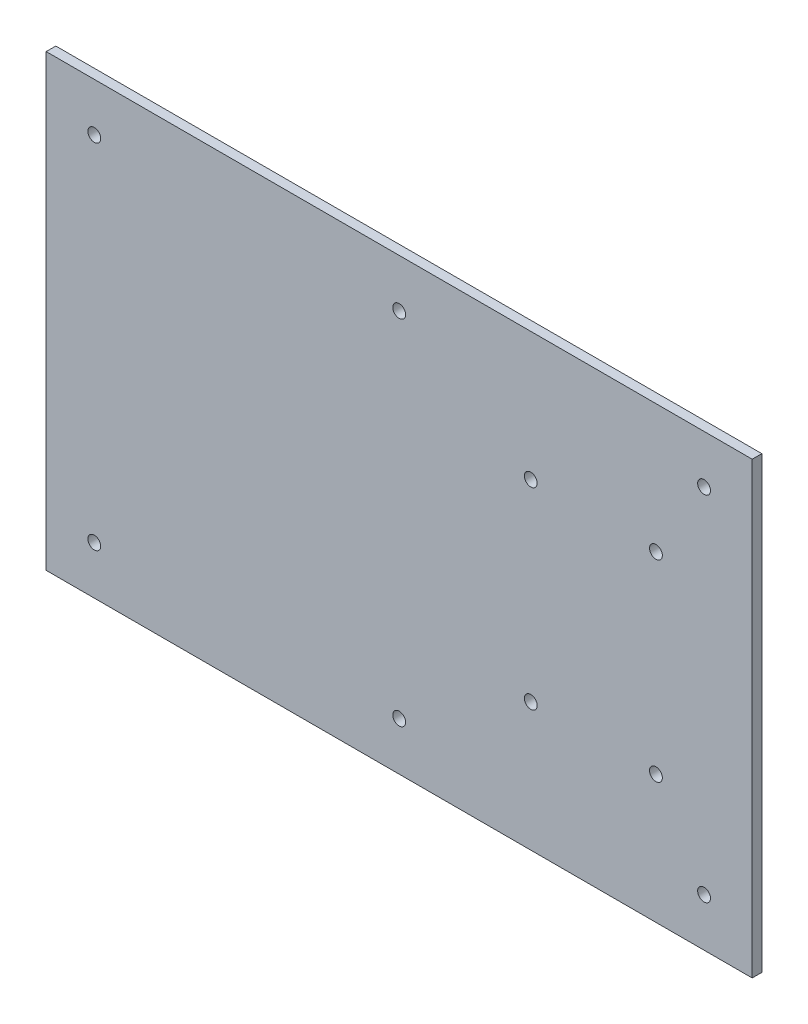
ISO-10303-21;
HEADER;
FILE_DESCRIPTION(('STEP AP214'),'2;1');
FILE_NAME('part.step','',(''),(''),'','','');
FILE_SCHEMA(('AUTOMOTIVE_DESIGN { 1 0 10303 214 1 1 1 1 }'));
ENDSEC;
DATA;
#1=APPLICATION_CONTEXT('core data for automotive mechanical design processes');
#2=APPLICATION_PROTOCOL_DEFINITION('international standard','automotive_design',2000,#1);
#3=PRODUCT_CONTEXT('',#1,'mechanical');
#4=PRODUCT('Part','Part','',(#3));
#5=PRODUCT_RELATED_PRODUCT_CATEGORY('part','',(#4));
#6=PRODUCT_DEFINITION_FORMATION('','',#4);
#7=PRODUCT_DEFINITION_CONTEXT('part definition',#1,'design');
#8=PRODUCT_DEFINITION('design','',#6,#7);
#9=PRODUCT_DEFINITION_SHAPE('','',#8);
#10=(LENGTH_UNIT() NAMED_UNIT(*) SI_UNIT(.MILLI.,.METRE.));
#11=(NAMED_UNIT(*) PLANE_ANGLE_UNIT() SI_UNIT($,.RADIAN.));
#12=(NAMED_UNIT(*) SI_UNIT($,.STERADIAN.) SOLID_ANGLE_UNIT());
#13=UNCERTAINTY_MEASURE_WITH_UNIT(LENGTH_MEASURE(1.E-05),#10,'distance_accuracy_value','');
#14=(GEOMETRIC_REPRESENTATION_CONTEXT(3) GLOBAL_UNCERTAINTY_ASSIGNED_CONTEXT((#13)) GLOBAL_UNIT_ASSIGNED_CONTEXT((#10,
#11,#12)) REPRESENTATION_CONTEXT('',''));
#15=CARTESIAN_POINT('',(0.,0.,0.));
#16=DIRECTION('',(0.,0.,1.));
#17=DIRECTION('',(1.,0.,0.));
#18=AXIS2_PLACEMENT_3D('',#15,#16,#17);
#19=CARTESIAN_POINT('',(0.,0.,3.));
#20=DIRECTION('',(1.,0.,0.));
#21=DIRECTION('',(0.,0.,-1.));
#22=AXIS2_PLACEMENT_3D('',#19,#20,#21);
#23=PLANE('',#22);
#24=DIRECTION('',(0.,-1.,0.));
#25=VECTOR('',#24,1.);
#26=CARTESIAN_POINT('',(0.,0.,0.));
#27=LINE('',#26,#25);
#28=CARTESIAN_POINT('',(0.,140.,0.));
#29=VERTEX_POINT('',#28);
#30=CARTESIAN_POINT('',(0.,0.,0.));
#31=VERTEX_POINT('',#30);
#32=EDGE_CURVE('E103',#29,#31,#27,.T.);
#33=ORIENTED_EDGE('',*,*,#32,.T.);
#34=DIRECTION('',(0.,0.,-1.));
#35=VECTOR('',#34,1.);
#36=CARTESIAN_POINT('',(0.,0.,3.));
#37=LINE('',#36,#35);
#38=CARTESIAN_POINT('',(0.,0.,3.));
#39=VERTEX_POINT('',#38);
#40=EDGE_CURVE('E11',#39,#31,#37,.T.);
#41=ORIENTED_EDGE('',*,*,#40,.F.);
#42=DIRECTION('',(0.,-1.,0.));
#43=VECTOR('',#42,1.);
#44=CARTESIAN_POINT('',(0.,0.,3.));
#45=LINE('',#44,#43);
#46=CARTESIAN_POINT('',(0.,140.,3.));
#47=VERTEX_POINT('',#46);
#48=EDGE_CURVE('E90',#47,#39,#45,.T.);
#49=ORIENTED_EDGE('',*,*,#48,.F.);
#50=DIRECTION('',(0.,0.,-1.));
#51=VECTOR('',#50,1.);
#52=CARTESIAN_POINT('',(0.,140.,3.));
#53=LINE('',#52,#51);
#54=EDGE_CURVE('E99',#47,#29,#53,.T.);
#55=ORIENTED_EDGE('',*,*,#54,.T.);
#56=EDGE_LOOP('',(#33,#41,#49,#55));
#57=FACE_BOUND('',#56,.T.);
#58=ADVANCED_FACE('F37',(#57),#23,.F.);
#59=CARTESIAN_POINT('',(0.,0.,3.));
#60=DIRECTION('',(0.,1.,0.));
#61=DIRECTION('',(0.,0.,1.));
#62=AXIS2_PLACEMENT_3D('',#59,#60,#61);
#63=PLANE('',#62);
#64=DIRECTION('',(1.,0.,0.));
#65=VECTOR('',#64,1.);
#66=CARTESIAN_POINT('',(0.,0.,0.));
#67=LINE('',#66,#65);
#68=CARTESIAN_POINT('',(220.,0.,0.));
#69=VERTEX_POINT('',#68);
#70=EDGE_CURVE('E94',#31,#69,#67,.T.);
#71=ORIENTED_EDGE('',*,*,#70,.T.);
#72=DIRECTION('',(0.,0.,-1.));
#73=VECTOR('',#72,1.);
#74=CARTESIAN_POINT('',(220.,0.,3.));
#75=LINE('',#74,#73);
#76=CARTESIAN_POINT('',(220.,0.,3.));
#77=VERTEX_POINT('',#76);
#78=EDGE_CURVE('E46',#77,#69,#75,.T.);
#79=ORIENTED_EDGE('',*,*,#78,.F.);
#80=DIRECTION('',(1.,0.,0.));
#81=VECTOR('',#80,1.);
#82=CARTESIAN_POINT('',(0.,0.,3.));
#83=LINE('',#82,#81);
#84=EDGE_CURVE('E85',#39,#77,#83,.T.);
#85=ORIENTED_EDGE('',*,*,#84,.F.);
#86=ORIENTED_EDGE('',*,*,#40,.T.);
#87=EDGE_LOOP('',(#71,#79,#85,#86));
#88=FACE_BOUND('',#87,.T.);
#89=ADVANCED_FACE('F93',(#88),#63,.F.);
#90=CARTESIAN_POINT('',(220.,0.,3.));
#91=DIRECTION('',(-1.,0.,0.));
#92=DIRECTION('',(0.,0.,1.));
#93=AXIS2_PLACEMENT_3D('',#90,#91,#92);
#94=PLANE('',#93);
#95=DIRECTION('',(0.,1.,0.));
#96=VECTOR('',#95,1.);
#97=CARTESIAN_POINT('',(220.,0.,0.));
#98=LINE('',#97,#96);
#99=CARTESIAN_POINT('',(220.,140.,0.));
#100=VERTEX_POINT('',#99);
#101=EDGE_CURVE('E72',#69,#100,#98,.T.);
#102=ORIENTED_EDGE('',*,*,#101,.T.);
#103=DIRECTION('',(0.,0.,-1.));
#104=VECTOR('',#103,1.);
#105=CARTESIAN_POINT('',(220.,140.,3.));
#106=LINE('',#105,#104);
#107=CARTESIAN_POINT('',(220.,140.,3.));
#108=VERTEX_POINT('',#107);
#109=EDGE_CURVE('E95',#108,#100,#106,.T.);
#110=ORIENTED_EDGE('',*,*,#109,.F.);
#111=DIRECTION('',(0.,1.,0.));
#112=VECTOR('',#111,1.);
#113=CARTESIAN_POINT('',(220.,0.,3.));
#114=LINE('',#113,#112);
#115=EDGE_CURVE('E88',#77,#108,#114,.T.);
#116=ORIENTED_EDGE('',*,*,#115,.F.);
#117=ORIENTED_EDGE('',*,*,#78,.T.);
#118=EDGE_LOOP('',(#102,#110,#116,#117));
#119=FACE_BOUND('',#118,.T.);
#120=ADVANCED_FACE('F97',(#119),#94,.F.);
#121=CARTESIAN_POINT('',(0.,140.,3.));
#122=DIRECTION('',(0.,-1.,0.));
#123=DIRECTION('',(0.,0.,-1.));
#124=AXIS2_PLACEMENT_3D('',#121,#122,#123);
#125=PLANE('',#124);
#126=DIRECTION('',(-1.,0.,0.));
#127=VECTOR('',#126,1.);
#128=CARTESIAN_POINT('',(0.,140.,0.));
#129=LINE('',#128,#127);
#130=EDGE_CURVE('E78',#100,#29,#129,.T.);
#131=ORIENTED_EDGE('',*,*,#130,.T.);
#132=ORIENTED_EDGE('',*,*,#54,.F.);
#133=DIRECTION('',(-1.,0.,0.));
#134=VECTOR('',#133,1.);
#135=CARTESIAN_POINT('',(0.,140.,3.));
#136=LINE('',#135,#134);
#137=EDGE_CURVE('E55',#108,#47,#136,.T.);
#138=ORIENTED_EDGE('',*,*,#137,.F.);
#139=ORIENTED_EDGE('',*,*,#109,.T.);
#140=EDGE_LOOP('',(#131,#132,#138,#139));
#141=FACE_BOUND('',#140,.T.);
#142=ADVANCED_FACE('F175',(#141),#125,.F.);
#143=CARTESIAN_POINT('',(0.,0.,3.));
#144=DIRECTION('',(0.,0.,-1.));
#145=DIRECTION('',(-1.,0.,0.));
#146=AXIS2_PLACEMENT_3D('',#143,#144,#145);
#147=PLANE('',#146);
#148=CARTESIAN_POINT('',(151.,40.,3.));
#149=DIRECTION('',(0.,0.,1.));
#150=DIRECTION('',(1.,0.,0.));
#151=AXIS2_PLACEMENT_3D('',#148,#149,#150);
#152=CIRCLE('',#151,2.);
#153=CARTESIAN_POINT('',(153.,40.,3.));
#154=VERTEX_POINT('',#153);
#155=EDGE_CURVE('E286',#154,#154,#152,.T.);
#156=ORIENTED_EDGE('',*,*,#155,.F.);
#157=EDGE_LOOP('',(#156));
#158=FACE_BOUND('',#157,.T.);
#159=CARTESIAN_POINT('',(190.,100.,3.));
#160=DIRECTION('',(0.,0.,1.));
#161=DIRECTION('',(-1.,0.,0.));
#162=AXIS2_PLACEMENT_3D('',#159,#160,#161);
#163=CIRCLE('',#162,2.);
#164=CARTESIAN_POINT('',(188.,100.,3.));
#165=VERTEX_POINT('',#164);
#166=EDGE_CURVE('E287',#165,#165,#163,.T.);
#167=ORIENTED_EDGE('',*,*,#166,.F.);
#168=EDGE_LOOP('',(#167));
#169=FACE_BOUND('',#168,.T.);
#170=CARTESIAN_POINT('',(151.,100.,3.));
#171=DIRECTION('',(0.,0.,1.));
#172=DIRECTION('',(-1.,0.,0.));
#173=AXIS2_PLACEMENT_3D('',#170,#171,#172);
#174=CIRCLE('',#173,2.);
#175=CARTESIAN_POINT('',(149.,100.,3.));
#176=VERTEX_POINT('',#175);
#177=EDGE_CURVE('E291',#176,#176,#174,.T.);
#178=ORIENTED_EDGE('',*,*,#177,.F.);
#179=EDGE_LOOP('',(#178));
#180=FACE_BOUND('',#179,.T.);
#181=CARTESIAN_POINT('',(190.,40.,3.));
#182=DIRECTION('',(0.,0.,1.));
#183=DIRECTION('',(1.,0.,0.));
#184=AXIS2_PLACEMENT_3D('',#181,#182,#183);
#185=CIRCLE('',#184,2.);
#186=CARTESIAN_POINT('',(192.,40.,3.));
#187=VERTEX_POINT('',#186);
#188=EDGE_CURVE('E116',#187,#187,#185,.T.);
#189=ORIENTED_EDGE('',*,*,#188,.F.);
#190=EDGE_LOOP('',(#189));
#191=FACE_BOUND('',#190,.T.);
#192=CARTESIAN_POINT('',(15.,15.,3.));
#193=DIRECTION('',(0.,0.,1.));
#194=DIRECTION('',(-1.,0.,0.));
#195=AXIS2_PLACEMENT_3D('',#192,#193,#194);
#196=CIRCLE('',#195,2.);
#197=CARTESIAN_POINT('',(13.,15.,3.));
#198=VERTEX_POINT('',#197);
#199=EDGE_CURVE('E123',#198,#198,#196,.T.);
#200=ORIENTED_EDGE('',*,*,#199,.F.);
#201=EDGE_LOOP('',(#200));
#202=FACE_BOUND('',#201,.T.);
#203=CARTESIAN_POINT('',(110.,15.,3.));
#204=DIRECTION('',(0.,0.,1.));
#205=DIRECTION('',(-1.,0.,0.));
#206=AXIS2_PLACEMENT_3D('',#203,#204,#205);
#207=CIRCLE('',#206,2.);
#208=CARTESIAN_POINT('',(108.,15.,3.));
#209=VERTEX_POINT('',#208);
#210=EDGE_CURVE('E132',#209,#209,#207,.T.);
#211=ORIENTED_EDGE('',*,*,#210,.F.);
#212=EDGE_LOOP('',(#211));
#213=FACE_BOUND('',#212,.T.);
#214=CARTESIAN_POINT('',(205.,15.,3.));
#215=DIRECTION('',(0.,0.,1.));
#216=DIRECTION('',(-1.,0.,0.));
#217=AXIS2_PLACEMENT_3D('',#214,#215,#216);
#218=CIRCLE('',#217,2.);
#219=CARTESIAN_POINT('',(203.,15.,3.));
#220=VERTEX_POINT('',#219);
#221=EDGE_CURVE('E162',#220,#220,#218,.T.);
#222=ORIENTED_EDGE('',*,*,#221,.F.);
#223=EDGE_LOOP('',(#222));
#224=FACE_BOUND('',#223,.T.);
#225=CARTESIAN_POINT('',(110.,125.,3.));
#226=DIRECTION('',(0.,0.,1.));
#227=DIRECTION('',(1.,0.,0.));
#228=AXIS2_PLACEMENT_3D('',#225,#226,#227);
#229=CIRCLE('',#228,2.);
#230=CARTESIAN_POINT('',(112.,125.,3.));
#231=VERTEX_POINT('',#230);
#232=EDGE_CURVE('E156',#231,#231,#229,.T.);
#233=ORIENTED_EDGE('',*,*,#232,.F.);
#234=EDGE_LOOP('',(#233));
#235=FACE_BOUND('',#234,.T.);
#236=CARTESIAN_POINT('',(205.,125.,3.));
#237=DIRECTION('',(0.,0.,1.));
#238=DIRECTION('',(1.,0.,0.));
#239=AXIS2_PLACEMENT_3D('',#236,#237,#238);
#240=CIRCLE('',#239,2.);
#241=CARTESIAN_POINT('',(207.,125.,3.));
#242=VERTEX_POINT('',#241);
#243=EDGE_CURVE('E144',#242,#242,#240,.T.);
#244=ORIENTED_EDGE('',*,*,#243,.F.);
#245=EDGE_LOOP('',(#244));
#246=FACE_BOUND('',#245,.T.);
#247=CARTESIAN_POINT('',(15.,125.,3.));
#248=DIRECTION('',(0.,0.,1.));
#249=DIRECTION('',(1.,0.,0.));
#250=AXIS2_PLACEMENT_3D('',#247,#248,#249);
#251=CIRCLE('',#250,2.);
#252=CARTESIAN_POINT('',(17.,125.,3.));
#253=VERTEX_POINT('',#252);
#254=EDGE_CURVE('E138',#253,#253,#251,.T.);
#255=ORIENTED_EDGE('',*,*,#254,.F.);
#256=EDGE_LOOP('',(#255));
#257=FACE_BOUND('',#256,.T.);
#258=ORIENTED_EDGE('',*,*,#48,.T.);
#259=ORIENTED_EDGE('',*,*,#84,.T.);
#260=ORIENTED_EDGE('',*,*,#115,.T.);
#261=ORIENTED_EDGE('',*,*,#137,.T.);
#262=EDGE_LOOP('',(#258,#259,#260,#261));
#263=FACE_BOUND('',#262,.T.);
#264=ADVANCED_FACE('F86',(#158,#169,#180,#191,#202,#213,#224,#235,#246,#257,#263),#147,.F.);
#265=CARTESIAN_POINT('',(0.,0.,0.));
#266=DIRECTION('',(0.,0.,-1.));
#267=DIRECTION('',(-1.,0.,0.));
#268=AXIS2_PLACEMENT_3D('',#265,#266,#267);
#269=PLANE('',#268);
#270=CARTESIAN_POINT('',(151.,40.,0.));
#271=DIRECTION('',(0.,0.,-1.));
#272=DIRECTION('',(-1.,0.,0.));
#273=AXIS2_PLACEMENT_3D('',#270,#271,#272);
#274=CIRCLE('',#273,2.);
#275=CARTESIAN_POINT('',(149.,40.,0.));
#276=VERTEX_POINT('',#275);
#277=EDGE_CURVE('E40',#276,#276,#274,.T.);
#278=ORIENTED_EDGE('',*,*,#277,.F.);
#279=EDGE_LOOP('',(#278));
#280=FACE_BOUND('',#279,.T.);
#281=CARTESIAN_POINT('',(190.,100.,0.));
#282=DIRECTION('',(0.,0.,-1.));
#283=DIRECTION('',(-1.,0.,0.));
#284=AXIS2_PLACEMENT_3D('',#281,#282,#283);
#285=CIRCLE('',#284,2.);
#286=CARTESIAN_POINT('',(188.,100.,0.));
#287=VERTEX_POINT('',#286);
#288=EDGE_CURVE('E118',#287,#287,#285,.T.);
#289=ORIENTED_EDGE('',*,*,#288,.F.);
#290=EDGE_LOOP('',(#289));
#291=FACE_BOUND('',#290,.T.);
#292=CARTESIAN_POINT('',(151.,100.,0.));
#293=DIRECTION('',(0.,0.,-1.));
#294=DIRECTION('',(-1.,0.,0.));
#295=AXIS2_PLACEMENT_3D('',#292,#293,#294);
#296=CIRCLE('',#295,2.);
#297=CARTESIAN_POINT('',(149.,100.,0.));
#298=VERTEX_POINT('',#297);
#299=EDGE_CURVE('E115',#298,#298,#296,.T.);
#300=ORIENTED_EDGE('',*,*,#299,.F.);
#301=EDGE_LOOP('',(#300));
#302=FACE_BOUND('',#301,.T.);
#303=CARTESIAN_POINT('',(190.,40.,0.));
#304=DIRECTION('',(0.,0.,-1.));
#305=DIRECTION('',(-1.,0.,0.));
#306=AXIS2_PLACEMENT_3D('',#303,#304,#305);
#307=CIRCLE('',#306,2.);
#308=CARTESIAN_POINT('',(188.,40.,0.));
#309=VERTEX_POINT('',#308);
#310=EDGE_CURVE('E112',#309,#309,#307,.T.);
#311=ORIENTED_EDGE('',*,*,#310,.F.);
#312=EDGE_LOOP('',(#311));
#313=FACE_BOUND('',#312,.T.);
#314=CARTESIAN_POINT('',(15.,15.,0.));
#315=DIRECTION('',(0.,0.,1.));
#316=DIRECTION('',(-1.,0.,0.));
#317=AXIS2_PLACEMENT_3D('',#314,#315,#316);
#318=CIRCLE('',#317,2.);
#319=CARTESIAN_POINT('',(13.,15.,0.));
#320=VERTEX_POINT('',#319);
#321=EDGE_CURVE('E127',#320,#320,#318,.T.);
#322=ORIENTED_EDGE('',*,*,#321,.T.);
#323=EDGE_LOOP('',(#322));
#324=FACE_BOUND('',#323,.T.);
#325=CARTESIAN_POINT('',(110.,15.,0.));
#326=DIRECTION('',(0.,0.,1.));
#327=DIRECTION('',(-1.,0.,0.));
#328=AXIS2_PLACEMENT_3D('',#325,#326,#327);
#329=CIRCLE('',#328,2.);
#330=CARTESIAN_POINT('',(108.,15.,0.));
#331=VERTEX_POINT('',#330);
#332=EDGE_CURVE('E165',#331,#331,#329,.T.);
#333=ORIENTED_EDGE('',*,*,#332,.T.);
#334=EDGE_LOOP('',(#333));
#335=FACE_BOUND('',#334,.T.);
#336=CARTESIAN_POINT('',(205.,15.,0.));
#337=DIRECTION('',(0.,0.,1.));
#338=DIRECTION('',(-1.,0.,0.));
#339=AXIS2_PLACEMENT_3D('',#336,#337,#338);
#340=CIRCLE('',#339,2.);
#341=CARTESIAN_POINT('',(203.,15.,0.));
#342=VERTEX_POINT('',#341);
#343=EDGE_CURVE('E159',#342,#342,#340,.T.);
#344=ORIENTED_EDGE('',*,*,#343,.T.);
#345=EDGE_LOOP('',(#344));
#346=FACE_BOUND('',#345,.T.);
#347=CARTESIAN_POINT('',(110.,125.,0.));
#348=DIRECTION('',(0.,0.,1.));
#349=DIRECTION('',(1.,0.,0.));
#350=AXIS2_PLACEMENT_3D('',#347,#348,#349);
#351=CIRCLE('',#350,2.);
#352=CARTESIAN_POINT('',(112.,125.,0.));
#353=VERTEX_POINT('',#352);
#354=EDGE_CURVE('E149',#353,#353,#351,.T.);
#355=ORIENTED_EDGE('',*,*,#354,.T.);
#356=EDGE_LOOP('',(#355));
#357=FACE_BOUND('',#356,.T.);
#358=CARTESIAN_POINT('',(205.,125.,0.));
#359=DIRECTION('',(0.,0.,1.));
#360=DIRECTION('',(1.,0.,0.));
#361=AXIS2_PLACEMENT_3D('',#358,#359,#360);
#362=CIRCLE('',#361,2.);
#363=CARTESIAN_POINT('',(207.,125.,0.));
#364=VERTEX_POINT('',#363);
#365=EDGE_CURVE('E140',#364,#364,#362,.T.);
#366=ORIENTED_EDGE('',*,*,#365,.T.);
#367=EDGE_LOOP('',(#366));
#368=FACE_BOUND('',#367,.T.);
#369=CARTESIAN_POINT('',(15.,125.,0.));
#370=DIRECTION('',(0.,0.,1.));
#371=DIRECTION('',(1.,0.,0.));
#372=AXIS2_PLACEMENT_3D('',#369,#370,#371);
#373=CIRCLE('',#372,2.);
#374=CARTESIAN_POINT('',(17.,125.,0.));
#375=VERTEX_POINT('',#374);
#376=EDGE_CURVE('E106',#375,#375,#373,.T.);
#377=ORIENTED_EDGE('',*,*,#376,.T.);
#378=EDGE_LOOP('',(#377));
#379=FACE_BOUND('',#378,.T.);
#380=ORIENTED_EDGE('',*,*,#32,.F.);
#381=ORIENTED_EDGE('',*,*,#130,.F.);
#382=ORIENTED_EDGE('',*,*,#101,.F.);
#383=ORIENTED_EDGE('',*,*,#70,.F.);
#384=EDGE_LOOP('',(#380,#381,#382,#383));
#385=FACE_BOUND('',#384,.T.);
#386=ADVANCED_FACE('F174',(#280,#291,#302,#313,#324,#335,#346,#357,#368,#379,#385),#269,.T.);
#387=CARTESIAN_POINT('',(15.,125.,0.));
#388=DIRECTION('',(0.,0.,1.));
#389=DIRECTION('',(1.,0.,0.));
#390=AXIS2_PLACEMENT_3D('',#387,#388,#389);
#391=CYLINDRICAL_SURFACE('',#390,2.);
#392=ORIENTED_EDGE('',*,*,#376,.F.);
#393=EDGE_LOOP('',(#392));
#394=FACE_BOUND('',#393,.T.);
#395=ORIENTED_EDGE('',*,*,#254,.T.);
#396=EDGE_LOOP('',(#395));
#397=FACE_BOUND('',#396,.T.);
#398=ADVANCED_FACE('F188',(#394,#397),#391,.F.);
#399=CARTESIAN_POINT('',(205.,125.,0.));
#400=DIRECTION('',(0.,0.,1.));
#401=DIRECTION('',(1.,0.,0.));
#402=AXIS2_PLACEMENT_3D('',#399,#400,#401);
#403=CYLINDRICAL_SURFACE('',#402,2.);
#404=ORIENTED_EDGE('',*,*,#365,.F.);
#405=EDGE_LOOP('',(#404));
#406=FACE_BOUND('',#405,.T.);
#407=ORIENTED_EDGE('',*,*,#243,.T.);
#408=EDGE_LOOP('',(#407));
#409=FACE_BOUND('',#408,.T.);
#410=ADVANCED_FACE('F185',(#406,#409),#403,.F.);
#411=CARTESIAN_POINT('',(110.,125.,0.));
#412=DIRECTION('',(0.,0.,1.));
#413=DIRECTION('',(1.,0.,0.));
#414=AXIS2_PLACEMENT_3D('',#411,#412,#413);
#415=CYLINDRICAL_SURFACE('',#414,2.);
#416=ORIENTED_EDGE('',*,*,#354,.F.);
#417=EDGE_LOOP('',(#416));
#418=FACE_BOUND('',#417,.T.);
#419=ORIENTED_EDGE('',*,*,#232,.T.);
#420=EDGE_LOOP('',(#419));
#421=FACE_BOUND('',#420,.T.);
#422=ADVANCED_FACE('F187',(#418,#421),#415,.F.);
#423=CARTESIAN_POINT('',(205.,15.,0.));
#424=DIRECTION('',(0.,0.,1.));
#425=DIRECTION('',(1.,0.,0.));
#426=AXIS2_PLACEMENT_3D('',#423,#424,#425);
#427=CYLINDRICAL_SURFACE('',#426,2.);
#428=ORIENTED_EDGE('',*,*,#343,.F.);
#429=EDGE_LOOP('',(#428));
#430=FACE_BOUND('',#429,.T.);
#431=ORIENTED_EDGE('',*,*,#221,.T.);
#432=EDGE_LOOP('',(#431));
#433=FACE_BOUND('',#432,.T.);
#434=ADVANCED_FACE('F195',(#430,#433),#427,.F.);
#435=CARTESIAN_POINT('',(110.,15.,0.));
#436=DIRECTION('',(0.,0.,1.));
#437=DIRECTION('',(1.,0.,0.));
#438=AXIS2_PLACEMENT_3D('',#435,#436,#437);
#439=CYLINDRICAL_SURFACE('',#438,2.);
#440=ORIENTED_EDGE('',*,*,#332,.F.);
#441=EDGE_LOOP('',(#440));
#442=FACE_BOUND('',#441,.T.);
#443=ORIENTED_EDGE('',*,*,#210,.T.);
#444=EDGE_LOOP('',(#443));
#445=FACE_BOUND('',#444,.T.);
#446=ADVANCED_FACE('F170',(#442,#445),#439,.F.);
#447=CARTESIAN_POINT('',(15.,15.,0.));
#448=DIRECTION('',(0.,0.,1.));
#449=DIRECTION('',(1.,0.,0.));
#450=AXIS2_PLACEMENT_3D('',#447,#448,#449);
#451=CYLINDRICAL_SURFACE('',#450,2.);
#452=ORIENTED_EDGE('',*,*,#321,.F.);
#453=EDGE_LOOP('',(#452));
#454=FACE_BOUND('',#453,.T.);
#455=ORIENTED_EDGE('',*,*,#199,.T.);
#456=EDGE_LOOP('',(#455));
#457=FACE_BOUND('',#456,.T.);
#458=ADVANCED_FACE('F237',(#454,#457),#451,.F.);
#459=CARTESIAN_POINT('',(190.,40.,-7.));
#460=DIRECTION('',(0.,0.,1.));
#461=DIRECTION('',(1.,0.,0.));
#462=AXIS2_PLACEMENT_3D('',#459,#460,#461);
#463=CYLINDRICAL_SURFACE('',#462,2.);
#464=ORIENTED_EDGE('',*,*,#310,.T.);
#465=EDGE_LOOP('',(#464));
#466=FACE_BOUND('',#465,.T.);
#467=ORIENTED_EDGE('',*,*,#188,.T.);
#468=EDGE_LOOP('',(#467));
#469=FACE_BOUND('',#468,.T.);
#470=ADVANCED_FACE('F247',(#466,#469),#463,.F.);
#471=CARTESIAN_POINT('',(151.,100.,-7.));
#472=DIRECTION('',(0.,0.,1.));
#473=DIRECTION('',(1.,0.,0.));
#474=AXIS2_PLACEMENT_3D('',#471,#472,#473);
#475=CYLINDRICAL_SURFACE('',#474,2.);
#476=ORIENTED_EDGE('',*,*,#299,.T.);
#477=EDGE_LOOP('',(#476));
#478=FACE_BOUND('',#477,.T.);
#479=ORIENTED_EDGE('',*,*,#177,.T.);
#480=EDGE_LOOP('',(#479));
#481=FACE_BOUND('',#480,.T.);
#482=ADVANCED_FACE('F252',(#478,#481),#475,.F.);
#483=CARTESIAN_POINT('',(190.,100.,-7.));
#484=DIRECTION('',(0.,0.,1.));
#485=DIRECTION('',(1.,0.,0.));
#486=AXIS2_PLACEMENT_3D('',#483,#484,#485);
#487=CYLINDRICAL_SURFACE('',#486,2.);
#488=ORIENTED_EDGE('',*,*,#288,.T.);
#489=EDGE_LOOP('',(#488));
#490=FACE_BOUND('',#489,.T.);
#491=ORIENTED_EDGE('',*,*,#166,.T.);
#492=EDGE_LOOP('',(#491));
#493=FACE_BOUND('',#492,.T.);
#494=ADVANCED_FACE('F261',(#490,#493),#487,.F.);
#495=CARTESIAN_POINT('',(151.,40.,-7.));
#496=DIRECTION('',(0.,0.,1.));
#497=DIRECTION('',(1.,0.,0.));
#498=AXIS2_PLACEMENT_3D('',#495,#496,#497);
#499=CYLINDRICAL_SURFACE('',#498,2.);
#500=ORIENTED_EDGE('',*,*,#277,.T.);
#501=EDGE_LOOP('',(#500));
#502=FACE_BOUND('',#501,.T.);
#503=ORIENTED_EDGE('',*,*,#155,.T.);
#504=EDGE_LOOP('',(#503));
#505=FACE_BOUND('',#504,.T.);
#506=ADVANCED_FACE('F271',(#502,#505),#499,.F.);
#507=CLOSED_SHELL('',(#58,#89,#120,#142,#264,#386,#398,#410,#422,#434,#446,#458,#470,#482,#494,#506));
#508=MANIFOLD_SOLID_BREP('B2',#507);
#509=ADVANCED_BREP_SHAPE_REPRESENTATION('',(#18,#508),#14);
#510=SHAPE_DEFINITION_REPRESENTATION(#9,#509);
ENDSEC;
END-ISO-10303-21;
